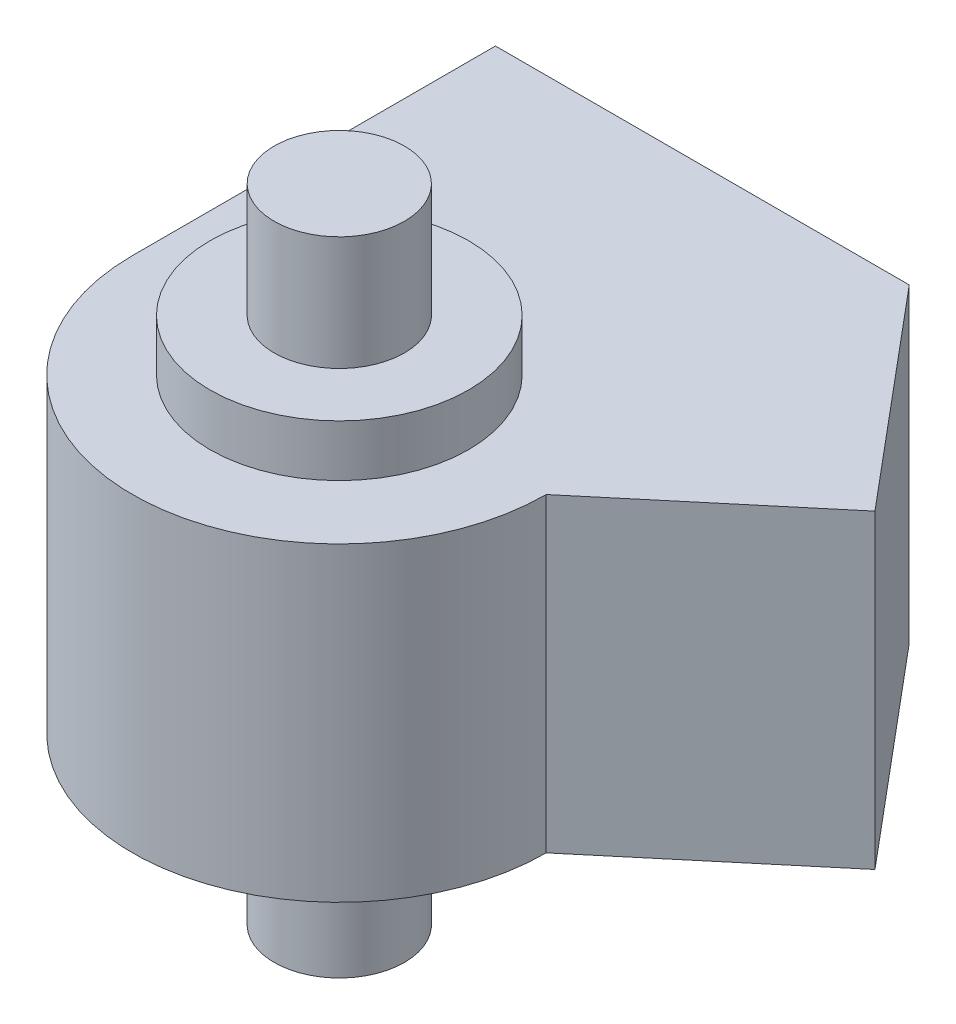
ISO-10303-21;
HEADER;
FILE_DESCRIPTION(('STEP AP214'),'2;1');
FILE_NAME('part.step','',(''),(''),'','','');
FILE_SCHEMA(('AUTOMOTIVE_DESIGN { 1 0 10303 214 1 1 1 1 }'));
ENDSEC;
DATA;
#1=APPLICATION_CONTEXT('core data for automotive mechanical design processes');
#2=APPLICATION_PROTOCOL_DEFINITION('international standard','automotive_design',2000,#1);
#3=PRODUCT_CONTEXT('',#1,'mechanical');
#4=PRODUCT('Part','Part','',(#3));
#5=PRODUCT_RELATED_PRODUCT_CATEGORY('part','',(#4));
#6=PRODUCT_DEFINITION_FORMATION('','',#4);
#7=PRODUCT_DEFINITION_CONTEXT('part definition',#1,'design');
#8=PRODUCT_DEFINITION('design','',#6,#7);
#9=PRODUCT_DEFINITION_SHAPE('','',#8);
#10=(LENGTH_UNIT() NAMED_UNIT(*) SI_UNIT(.MILLI.,.METRE.));
#11=(NAMED_UNIT(*) PLANE_ANGLE_UNIT() SI_UNIT($,.RADIAN.));
#12=(NAMED_UNIT(*) SI_UNIT($,.STERADIAN.) SOLID_ANGLE_UNIT());
#13=UNCERTAINTY_MEASURE_WITH_UNIT(LENGTH_MEASURE(1.E-05),#10,'distance_accuracy_value','');
#14=(GEOMETRIC_REPRESENTATION_CONTEXT(3) GLOBAL_UNCERTAINTY_ASSIGNED_CONTEXT((#13)) GLOBAL_UNIT_ASSIGNED_CONTEXT((#10,
#11,#12)) REPRESENTATION_CONTEXT('',''));
#15=CARTESIAN_POINT('',(0.,0.,0.));
#16=DIRECTION('',(0.,0.,1.));
#17=DIRECTION('',(1.,0.,0.));
#18=AXIS2_PLACEMENT_3D('',#15,#16,#17);
#19=CARTESIAN_POINT('',(0.,-12.7,0.));
#20=DIRECTION('',(0.,1.,0.));
#21=DIRECTION('',(-1.,0.,0.));
#22=AXIS2_PLACEMENT_3D('',#19,#20,#21);
#23=PLANE('',#22);
#24=CARTESIAN_POINT('',(0.,-12.7,0.));
#25=DIRECTION('',(0.,-1.,0.));
#26=DIRECTION('',(1.,0.,0.));
#27=AXIS2_PLACEMENT_3D('',#24,#25,#26);
#28=CIRCLE('',#27,4.00000000000001);
#29=CARTESIAN_POINT('',(4.00000000000001,-12.7,0.));
#30=VERTEX_POINT('',#29);
#31=EDGE_CURVE('E332',#30,#30,#28,.T.);
#32=ORIENTED_EDGE('',*,*,#31,.F.);
#33=EDGE_LOOP('',(#32));
#34=FACE_BOUND('',#33,.T.);
#35=CARTESIAN_POINT('',(0.,-12.7,0.));
#36=DIRECTION('',(0.,-1.,0.));
#37=DIRECTION('',(1.,0.,0.));
#38=AXIS2_PLACEMENT_3D('',#35,#36,#37);
#39=CIRCLE('',#38,7.93750000000001);
#40=CARTESIAN_POINT('',(7.93750000000002,-12.7,0.));
#41=VERTEX_POINT('',#40);
#42=EDGE_CURVE('E335',#41,#41,#39,.T.);
#43=ORIENTED_EDGE('',*,*,#42,.T.);
#44=EDGE_LOOP('',(#43));
#45=FACE_BOUND('',#44,.T.);
#46=ADVANCED_FACE('F43',(#34,#45),#23,.F.);
#47=CARTESIAN_POINT('',(0.,0.,0.));
#48=DIRECTION('',(0.,-1.,0.));
#49=DIRECTION('',(1.,0.,0.));
#50=AXIS2_PLACEMENT_3D('',#47,#48,#49);
#51=CYLINDRICAL_SURFACE('',#50,4.00000000000001);
#52=CARTESIAN_POINT('',(0.,-19.7,0.));
#53=DIRECTION('',(0.,-1.,0.));
#54=DIRECTION('',(1.,0.,0.));
#55=AXIS2_PLACEMENT_3D('',#52,#53,#54);
#56=CIRCLE('',#55,4.00000000000001);
#57=CARTESIAN_POINT('',(4.00000000000001,-19.7,0.));
#58=VERTEX_POINT('',#57);
#59=EDGE_CURVE('E329',#58,#58,#56,.T.);
#60=ORIENTED_EDGE('',*,*,#59,.F.);
#61=EDGE_LOOP('',(#60));
#62=FACE_BOUND('',#61,.T.);
#63=ORIENTED_EDGE('',*,*,#31,.T.);
#64=EDGE_LOOP('',(#63));
#65=FACE_BOUND('',#64,.T.);
#66=ADVANCED_FACE('F146',(#62,#65),#51,.T.);
#67=CARTESIAN_POINT('',(0.,-19.7,0.));
#68=DIRECTION('',(0.,1.,0.));
#69=DIRECTION('',(-1.,0.,0.));
#70=AXIS2_PLACEMENT_3D('',#67,#68,#69);
#71=PLANE('',#70);
#72=ORIENTED_EDGE('',*,*,#59,.T.);
#73=EDGE_LOOP('',(#72));
#74=FACE_BOUND('',#73,.T.);
#75=ADVANCED_FACE('F45',(#74),#71,.F.);
#76=CARTESIAN_POINT('',(0.,0.,0.));
#77=DIRECTION('',(0.,-1.,0.));
#78=DIRECTION('',(1.,0.,0.));
#79=AXIS2_PLACEMENT_3D('',#76,#77,#78);
#80=CYLINDRICAL_SURFACE('',#79,7.93750000000001);
#81=ORIENTED_EDGE('',*,*,#42,.F.);
#82=EDGE_LOOP('',(#81));
#83=FACE_BOUND('',#82,.T.);
#84=CARTESIAN_POINT('',(0.,-9.525,0.));
#85=DIRECTION('',(0.,-1.,0.));
#86=DIRECTION('',(1.,0.,0.));
#87=AXIS2_PLACEMENT_3D('',#84,#85,#86);
#88=CIRCLE('',#87,7.93750000000001);
#89=CARTESIAN_POINT('',(7.93750000000001,-9.52499999999999,0.));
#90=VERTEX_POINT('',#89);
#91=EDGE_CURVE('E122',#90,#90,#88,.T.);
#92=ORIENTED_EDGE('',*,*,#91,.T.);
#93=EDGE_LOOP('',(#92));
#94=FACE_BOUND('',#93,.T.);
#95=ADVANCED_FACE('F154',(#83,#94),#80,.T.);
#96=CARTESIAN_POINT('',(0.,-9.525,0.));
#97=DIRECTION('',(0.,1.,0.));
#98=DIRECTION('',(-1.,0.,0.));
#99=AXIS2_PLACEMENT_3D('',#96,#97,#98);
#100=PLANE('',#99);
#101=ORIENTED_EDGE('',*,*,#91,.F.);
#102=EDGE_LOOP('',(#101));
#103=FACE_BOUND('',#102,.T.);
#104=CARTESIAN_POINT('',(0.,-9.52499999999999,0.));
#105=DIRECTION('',(0.,-1.,0.));
#106=DIRECTION('',(1.,0.,0.));
#107=AXIS2_PLACEMENT_3D('',#104,#105,#106);
#108=CIRCLE('',#107,12.7);
#109=CARTESIAN_POINT('',(12.7,-9.52499999999999,0.));
#110=VERTEX_POINT('',#109);
#111=CARTESIAN_POINT('',(-12.7,-9.52499999999999,0.));
#112=VERTEX_POINT('',#111);
#113=EDGE_CURVE('E110',#110,#112,#108,.T.);
#114=ORIENTED_EDGE('',*,*,#113,.T.);
#115=DIRECTION('',(0.,0.,-1.));
#116=VECTOR('',#115,1.);
#117=CARTESIAN_POINT('',(-12.7,-9.52499999999999,-22.2836506263098));
#118=LINE('',#117,#116);
#119=CARTESIAN_POINT('',(-12.7,-9.525,-22.2836506263098));
#120=VERTEX_POINT('',#119);
#121=EDGE_CURVE('E77',#112,#120,#118,.T.);
#122=ORIENTED_EDGE('',*,*,#121,.T.);
#123=DIRECTION('',(1.,0.,0.));
#124=VECTOR('',#123,1.);
#125=CARTESIAN_POINT('',(12.7,-9.52499999999999,-22.2836506263098));
#126=LINE('',#125,#124);
#127=CARTESIAN_POINT('',(12.7,-9.52499999999999,-22.2836506263098));
#128=VERTEX_POINT('',#127);
#129=EDGE_CURVE('E67',#120,#128,#126,.T.);
#130=ORIENTED_EDGE('',*,*,#129,.T.);
#131=DIRECTION('',(0.642787609686538,0.,0.766044443118979));
#132=VECTOR('',#131,1.);
#133=CARTESIAN_POINT('',(23.6725559511026,-9.52499999999998,-9.20706765164223));
#134=LINE('',#133,#132);
#135=CARTESIAN_POINT('',(23.6725559511026,-9.52499999999999,-9.20706765164222));
#136=VERTEX_POINT('',#135);
#137=EDGE_CURVE('E80',#128,#136,#134,.T.);
#138=ORIENTED_EDGE('',*,*,#137,.T.);
#139=DIRECTION('',(-0.766044443118979,0.,0.642787609686538));
#140=VECTOR('',#139,1.);
#141=CARTESIAN_POINT('',(12.7,-9.52499999999999,0.));
#142=LINE('',#141,#140);
#143=EDGE_CURVE('E327',#136,#110,#142,.T.);
#144=ORIENTED_EDGE('',*,*,#143,.T.);
#145=EDGE_LOOP('',(#114,#122,#130,#138,#144));
#146=FACE_BOUND('',#145,.T.);
#147=ADVANCED_FACE('F165',(#103,#146),#100,.F.);
#148=CARTESIAN_POINT('',(0.,0.,0.));
#149=DIRECTION('',(0.,-1.,0.));
#150=DIRECTION('',(1.,0.,0.));
#151=AXIS2_PLACEMENT_3D('',#148,#149,#150);
#152=CYLINDRICAL_SURFACE('',#151,12.7);
#153=DIRECTION('',(0.,1.,0.));
#154=VECTOR('',#153,1.);
#155=CARTESIAN_POINT('',(-12.7,-52.1808778089436,0.));
#156=LINE('',#155,#154);
#157=CARTESIAN_POINT('',(-12.7,9.525,0.));
#158=VERTEX_POINT('',#157);
#159=EDGE_CURVE('E318',#112,#158,#156,.T.);
#160=ORIENTED_EDGE('',*,*,#159,.F.);
#161=ORIENTED_EDGE('',*,*,#113,.F.);
#162=DIRECTION('',(0.,1.,0.));
#163=VECTOR('',#162,1.);
#164=CARTESIAN_POINT('',(12.7,-52.1808778089436,0.));
#165=LINE('',#164,#163);
#166=CARTESIAN_POINT('',(12.7,9.525,0.));
#167=VERTEX_POINT('',#166);
#168=EDGE_CURVE('E58',#110,#167,#165,.T.);
#169=ORIENTED_EDGE('',*,*,#168,.T.);
#170=CARTESIAN_POINT('',(0.,9.52500000000001,0.));
#171=DIRECTION('',(0.,-1.,0.));
#172=DIRECTION('',(1.,0.,0.));
#173=AXIS2_PLACEMENT_3D('',#170,#171,#172);
#174=CIRCLE('',#173,12.7);
#175=EDGE_CURVE('E108',#167,#158,#174,.T.);
#176=ORIENTED_EDGE('',*,*,#175,.T.);
#177=EDGE_LOOP('',(#160,#161,#169,#176));
#178=FACE_BOUND('',#177,.T.);
#179=ADVANCED_FACE('F107',(#178),#152,.T.);
#180=CARTESIAN_POINT('',(0.,9.525,0.));
#181=DIRECTION('',(0.,1.,0.));
#182=DIRECTION('',(-1.,0.,0.));
#183=AXIS2_PLACEMENT_3D('',#180,#181,#182);
#184=PLANE('',#183);
#185=CARTESIAN_POINT('',(0.,9.525,0.));
#186=DIRECTION('',(0.,-1.,0.));
#187=DIRECTION('',(1.,0.,0.));
#188=AXIS2_PLACEMENT_3D('',#185,#186,#187);
#189=CIRCLE('',#188,7.9375);
#190=CARTESIAN_POINT('',(7.9375,9.525,0.));
#191=VERTEX_POINT('',#190);
#192=EDGE_CURVE('E117',#191,#191,#189,.T.);
#193=ORIENTED_EDGE('',*,*,#192,.T.);
#194=EDGE_LOOP('',(#193));
#195=FACE_BOUND('',#194,.T.);
#196=ORIENTED_EDGE('',*,*,#175,.F.);
#197=DIRECTION('',(0.766044443118979,0.,-0.642787609686538));
#198=VECTOR('',#197,1.);
#199=CARTESIAN_POINT('',(12.7,9.525,0.));
#200=LINE('',#199,#198);
#201=CARTESIAN_POINT('',(23.6725559511026,9.525,-9.20706765164222));
#202=VERTEX_POINT('',#201);
#203=EDGE_CURVE('E95',#167,#202,#200,.T.);
#204=ORIENTED_EDGE('',*,*,#203,.T.);
#205=DIRECTION('',(-0.642787609686538,0.,-0.766044443118979));
#206=VECTOR('',#205,1.);
#207=CARTESIAN_POINT('',(23.6725559511026,9.525,-9.20706765164222));
#208=LINE('',#207,#206);
#209=CARTESIAN_POINT('',(12.7,9.525,-22.2836506263098));
#210=VERTEX_POINT('',#209);
#211=EDGE_CURVE('E102',#202,#210,#208,.T.);
#212=ORIENTED_EDGE('',*,*,#211,.T.);
#213=DIRECTION('',(-1.,0.,0.));
#214=VECTOR('',#213,1.);
#215=CARTESIAN_POINT('',(12.7,9.525,-22.2836506263098));
#216=LINE('',#215,#214);
#217=CARTESIAN_POINT('',(-12.7,9.525,-22.2836506263098));
#218=VERTEX_POINT('',#217);
#219=EDGE_CURVE('E320',#210,#218,#216,.T.);
#220=ORIENTED_EDGE('',*,*,#219,.T.);
#221=DIRECTION('',(0.,0.,1.));
#222=VECTOR('',#221,1.);
#223=CARTESIAN_POINT('',(-12.7,9.525,-22.2836506263098));
#224=LINE('',#223,#222);
#225=EDGE_CURVE('E111',#218,#158,#224,.T.);
#226=ORIENTED_EDGE('',*,*,#225,.T.);
#227=EDGE_LOOP('',(#196,#204,#212,#220,#226));
#228=FACE_BOUND('',#227,.T.);
#229=ADVANCED_FACE('F114',(#195,#228),#184,.T.);
#230=CARTESIAN_POINT('',(0.,0.,0.));
#231=DIRECTION('',(0.,-1.,0.));
#232=DIRECTION('',(1.,0.,0.));
#233=AXIS2_PLACEMENT_3D('',#230,#231,#232);
#234=CYLINDRICAL_SURFACE('',#233,7.9375);
#235=CARTESIAN_POINT('',(0.,12.7,0.));
#236=DIRECTION('',(0.,-1.,0.));
#237=DIRECTION('',(1.,0.,0.));
#238=AXIS2_PLACEMENT_3D('',#235,#236,#237);
#239=CIRCLE('',#238,7.9375);
#240=CARTESIAN_POINT('',(7.93749999999999,12.7,0.));
#241=VERTEX_POINT('',#240);
#242=EDGE_CURVE('E120',#241,#241,#239,.T.);
#243=ORIENTED_EDGE('',*,*,#242,.T.);
#244=EDGE_LOOP('',(#243));
#245=FACE_BOUND('',#244,.T.);
#246=ORIENTED_EDGE('',*,*,#192,.F.);
#247=EDGE_LOOP('',(#246));
#248=FACE_BOUND('',#247,.T.);
#249=ADVANCED_FACE('F144',(#245,#248),#234,.T.);
#250=CARTESIAN_POINT('',(0.,12.7,0.));
#251=DIRECTION('',(0.,1.,0.));
#252=DIRECTION('',(-1.,0.,0.));
#253=AXIS2_PLACEMENT_3D('',#250,#251,#252);
#254=PLANE('',#253);
#255=CARTESIAN_POINT('',(0.,12.7,0.));
#256=DIRECTION('',(0.,-1.,0.));
#257=DIRECTION('',(1.,0.,0.));
#258=AXIS2_PLACEMENT_3D('',#255,#256,#257);
#259=CIRCLE('',#258,3.99999999999999);
#260=CARTESIAN_POINT('',(3.99999999999999,12.7,0.));
#261=VERTEX_POINT('',#260);
#262=EDGE_CURVE('E51',#261,#261,#259,.T.);
#263=ORIENTED_EDGE('',*,*,#262,.T.);
#264=EDGE_LOOP('',(#263));
#265=FACE_BOUND('',#264,.T.);
#266=ORIENTED_EDGE('',*,*,#242,.F.);
#267=EDGE_LOOP('',(#266));
#268=FACE_BOUND('',#267,.T.);
#269=ADVANCED_FACE('F130',(#265,#268),#254,.T.);
#270=CARTESIAN_POINT('',(0.,0.,0.));
#271=DIRECTION('',(0.,-1.,0.));
#272=DIRECTION('',(1.,0.,0.));
#273=AXIS2_PLACEMENT_3D('',#270,#271,#272);
#274=CYLINDRICAL_SURFACE('',#273,3.99999999999999);
#275=CARTESIAN_POINT('',(0.,19.7,0.));
#276=DIRECTION('',(0.,-1.,0.));
#277=DIRECTION('',(1.,0.,0.));
#278=AXIS2_PLACEMENT_3D('',#275,#276,#277);
#279=CIRCLE('',#278,3.99999999999999);
#280=CARTESIAN_POINT('',(3.99999999999999,19.7,0.));
#281=VERTEX_POINT('',#280);
#282=EDGE_CURVE('E11',#281,#281,#279,.T.);
#283=ORIENTED_EDGE('',*,*,#282,.T.);
#284=EDGE_LOOP('',(#283));
#285=FACE_BOUND('',#284,.T.);
#286=ORIENTED_EDGE('',*,*,#262,.F.);
#287=EDGE_LOOP('',(#286));
#288=FACE_BOUND('',#287,.T.);
#289=ADVANCED_FACE('F133',(#285,#288),#274,.T.);
#290=CARTESIAN_POINT('',(0.,19.7,0.));
#291=DIRECTION('',(0.,-1.,0.));
#292=DIRECTION('',(1.,0.,0.));
#293=AXIS2_PLACEMENT_3D('',#290,#291,#292);
#294=PLANE('',#293);
#295=ORIENTED_EDGE('',*,*,#282,.F.);
#296=EDGE_LOOP('',(#295));
#297=FACE_BOUND('',#296,.T.);
#298=ADVANCED_FACE('F135',(#297),#294,.F.);
#299=CARTESIAN_POINT('',(-12.7,-52.1808778089436,-22.2836506263098));
#300=DIRECTION('',(-1.,0.,0.));
#301=DIRECTION('',(0.,0.,1.));
#302=AXIS2_PLACEMENT_3D('',#299,#300,#301);
#303=PLANE('',#302);
#304=ORIENTED_EDGE('',*,*,#121,.F.);
#305=ORIENTED_EDGE('',*,*,#159,.T.);
#306=ORIENTED_EDGE('',*,*,#225,.F.);
#307=DIRECTION('',(0.,1.,0.));
#308=VECTOR('',#307,1.);
#309=CARTESIAN_POINT('',(-12.7,-52.1808778089436,-22.2836506263098));
#310=LINE('',#309,#308);
#311=EDGE_CURVE('E321',#120,#218,#310,.T.);
#312=ORIENTED_EDGE('',*,*,#311,.F.);
#313=EDGE_LOOP('',(#304,#305,#306,#312));
#314=FACE_BOUND('',#313,.T.);
#315=ADVANCED_FACE('F142',(#314),#303,.T.);
#316=CARTESIAN_POINT('',(12.7,-52.1808778089436,-22.2836506263098));
#317=DIRECTION('',(0.,0.,-1.));
#318=DIRECTION('',(-1.,0.,0.));
#319=AXIS2_PLACEMENT_3D('',#316,#317,#318);
#320=PLANE('',#319);
#321=ORIENTED_EDGE('',*,*,#129,.F.);
#322=ORIENTED_EDGE('',*,*,#311,.T.);
#323=ORIENTED_EDGE('',*,*,#219,.F.);
#324=DIRECTION('',(0.,1.,0.));
#325=VECTOR('',#324,1.);
#326=CARTESIAN_POINT('',(12.7,-52.1808778089436,-22.2836506263098));
#327=LINE('',#326,#325);
#328=EDGE_CURVE('E316',#128,#210,#327,.T.);
#329=ORIENTED_EDGE('',*,*,#328,.F.);
#330=EDGE_LOOP('',(#321,#322,#323,#329));
#331=FACE_BOUND('',#330,.T.);
#332=ADVANCED_FACE('F192',(#331),#320,.T.);
#333=CARTESIAN_POINT('',(23.6725559511026,-52.1808778089436,-9.20706765164222));
#334=DIRECTION('',(0.766044443118979,0.,-0.642787609686538));
#335=DIRECTION('',(-0.642787609686538,0.,-0.766044443118979));
#336=AXIS2_PLACEMENT_3D('',#333,#334,#335);
#337=PLANE('',#336);
#338=ORIENTED_EDGE('',*,*,#137,.F.);
#339=ORIENTED_EDGE('',*,*,#328,.T.);
#340=ORIENTED_EDGE('',*,*,#211,.F.);
#341=DIRECTION('',(0.,1.,0.));
#342=VECTOR('',#341,1.);
#343=CARTESIAN_POINT('',(23.6725559511026,-52.1808778089436,-9.20706765164222));
#344=LINE('',#343,#342);
#345=EDGE_CURVE('E97',#136,#202,#344,.T.);
#346=ORIENTED_EDGE('',*,*,#345,.F.);
#347=EDGE_LOOP('',(#338,#339,#340,#346));
#348=FACE_BOUND('',#347,.T.);
#349=ADVANCED_FACE('F200',(#348),#337,.T.);
#350=CARTESIAN_POINT('',(12.7,-52.1808778089436,0.));
#351=DIRECTION('',(0.642787609686538,0.,0.766044443118979));
#352=DIRECTION('',(0.766044443118979,0.,-0.642787609686538));
#353=AXIS2_PLACEMENT_3D('',#350,#351,#352);
#354=PLANE('',#353);
#355=ORIENTED_EDGE('',*,*,#143,.F.);
#356=ORIENTED_EDGE('',*,*,#345,.T.);
#357=ORIENTED_EDGE('',*,*,#203,.F.);
#358=ORIENTED_EDGE('',*,*,#168,.F.);
#359=EDGE_LOOP('',(#355,#356,#357,#358));
#360=FACE_BOUND('',#359,.T.);
#361=ADVANCED_FACE('F96',(#360),#354,.T.);
#362=CLOSED_SHELL('',(#46,#66,#75,#95,#147,#179,#229,#249,#269,#289,#298,#315,#332,#349,#361));
#363=MANIFOLD_SOLID_BREP('B2',#362);
#364=ADVANCED_BREP_SHAPE_REPRESENTATION('',(#18,#363),#14);
#365=SHAPE_DEFINITION_REPRESENTATION(#9,#364);
ENDSEC;
END-ISO-10303-21;
